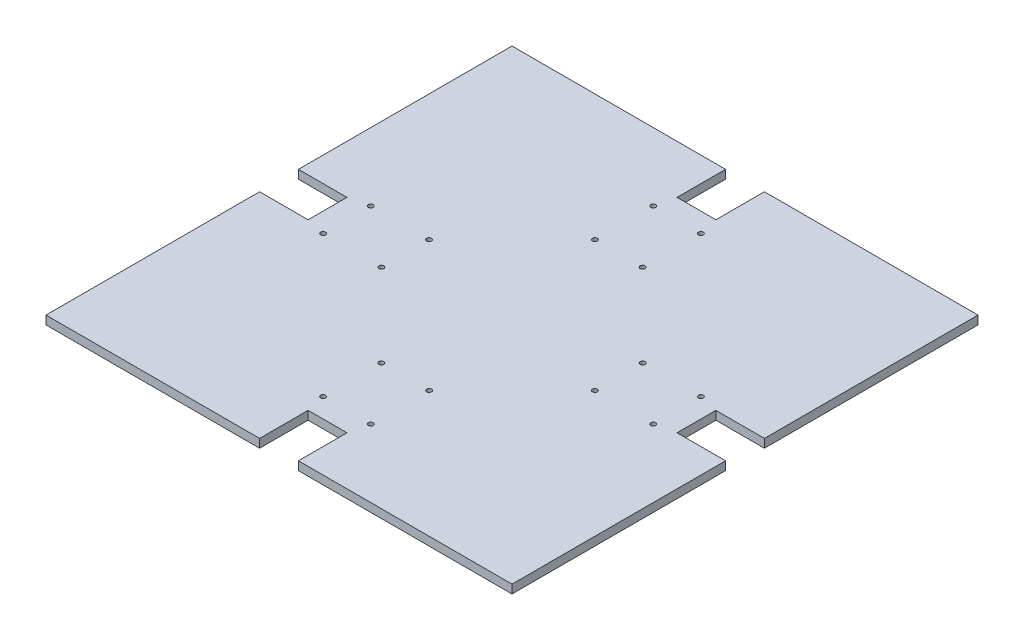
ISO-10303-21;
HEADER;
FILE_DESCRIPTION(('STEP AP214'),'2;1');
FILE_NAME('part.step','',(''),(''),'','','');
FILE_SCHEMA(('AUTOMOTIVE_DESIGN { 1 0 10303 214 1 1 1 1 }'));
ENDSEC;
DATA;
#1=APPLICATION_CONTEXT('core data for automotive mechanical design processes');
#2=APPLICATION_PROTOCOL_DEFINITION('international standard','automotive_design',2000,#1);
#3=PRODUCT_CONTEXT('',#1,'mechanical');
#4=PRODUCT('Part','Part','',(#3));
#5=PRODUCT_RELATED_PRODUCT_CATEGORY('part','',(#4));
#6=PRODUCT_DEFINITION_FORMATION('','',#4);
#7=PRODUCT_DEFINITION_CONTEXT('part definition',#1,'design');
#8=PRODUCT_DEFINITION('design','',#6,#7);
#9=PRODUCT_DEFINITION_SHAPE('','',#8);
#10=(LENGTH_UNIT() NAMED_UNIT(*) SI_UNIT(.MILLI.,.METRE.));
#11=(NAMED_UNIT(*) PLANE_ANGLE_UNIT() SI_UNIT($,.RADIAN.));
#12=(NAMED_UNIT(*) SI_UNIT($,.STERADIAN.) SOLID_ANGLE_UNIT());
#13=UNCERTAINTY_MEASURE_WITH_UNIT(LENGTH_MEASURE(1.E-05),#10,'distance_accuracy_value','');
#14=(GEOMETRIC_REPRESENTATION_CONTEXT(3) GLOBAL_UNCERTAINTY_ASSIGNED_CONTEXT((#13)) GLOBAL_UNIT_ASSIGNED_CONTEXT((#10,
#11,#12)) REPRESENTATION_CONTEXT('',''));
#15=CARTESIAN_POINT('',(0.,0.,0.));
#16=DIRECTION('',(0.,0.,1.));
#17=DIRECTION('',(1.,0.,0.));
#18=AXIS2_PLACEMENT_3D('',#15,#16,#17);
#19=CARTESIAN_POINT('',(152.4,5.588,-152.4));
#20=DIRECTION('',(-1.,0.,0.));
#21=DIRECTION('',(0.,0.,1.));
#22=AXIS2_PLACEMENT_3D('',#19,#20,#21);
#23=PLANE('',#22);
#24=DIRECTION('',(0.,0.,-1.));
#25=VECTOR('',#24,1.);
#26=CARTESIAN_POINT('',(152.4,0.,-152.4));
#27=LINE('',#26,#25);
#28=CARTESIAN_POINT('',(152.4,0.,152.4));
#29=VERTEX_POINT('',#28);
#30=CARTESIAN_POINT('',(152.4,0.,12.7));
#31=VERTEX_POINT('',#30);
#32=EDGE_CURVE('E202',#29,#31,#27,.T.);
#33=ORIENTED_EDGE('',*,*,#32,.T.);
#34=DIRECTION('',(0.,1.,0.));
#35=VECTOR('',#34,1.);
#36=CARTESIAN_POINT('',(152.4,0.,12.7));
#37=LINE('',#36,#35);
#38=CARTESIAN_POINT('',(152.4,5.588,12.7));
#39=VERTEX_POINT('',#38);
#40=EDGE_CURVE('E383',#31,#39,#37,.T.);
#41=ORIENTED_EDGE('',*,*,#40,.T.);
#42=DIRECTION('',(0.,0.,-1.));
#43=VECTOR('',#42,1.);
#44=CARTESIAN_POINT('',(152.4,5.588,-152.4));
#45=LINE('',#44,#43);
#46=CARTESIAN_POINT('',(152.4,5.588,152.4));
#47=VERTEX_POINT('',#46);
#48=EDGE_CURVE('E354',#47,#39,#45,.T.);
#49=ORIENTED_EDGE('',*,*,#48,.F.);
#50=DIRECTION('',(0.,-1.,0.));
#51=VECTOR('',#50,1.);
#52=CARTESIAN_POINT('',(152.4,5.588,152.4));
#53=LINE('',#52,#51);
#54=EDGE_CURVE('E212',#47,#29,#53,.T.);
#55=ORIENTED_EDGE('',*,*,#54,.T.);
#56=EDGE_LOOP('',(#33,#41,#49,#55));
#57=FACE_BOUND('',#56,.T.);
#58=ADVANCED_FACE('F33',(#57),#23,.F.);
#59=CARTESIAN_POINT('',(-152.4,5.588,-152.4));
#60=DIRECTION('',(0.,0.,1.));
#61=DIRECTION('',(1.,0.,0.));
#62=AXIS2_PLACEMENT_3D('',#59,#60,#61);
#63=PLANE('',#62);
#64=DIRECTION('',(-1.,0.,0.));
#65=VECTOR('',#64,1.);
#66=CARTESIAN_POINT('',(-152.4,0.,-152.4));
#67=LINE('',#66,#65);
#68=CARTESIAN_POINT('',(152.4,0.,-152.4));
#69=VERTEX_POINT('',#68);
#70=CARTESIAN_POINT('',(12.7,0.,-152.4));
#71=VERTEX_POINT('',#70);
#72=EDGE_CURVE('E190',#69,#71,#67,.T.);
#73=ORIENTED_EDGE('',*,*,#72,.T.);
#74=DIRECTION('',(0.,1.,0.));
#75=VECTOR('',#74,1.);
#76=CARTESIAN_POINT('',(12.7,0.,-152.4));
#77=LINE('',#76,#75);
#78=CARTESIAN_POINT('',(12.7,5.588,-152.4));
#79=VERTEX_POINT('',#78);
#80=EDGE_CURVE('E170',#71,#79,#77,.T.);
#81=ORIENTED_EDGE('',*,*,#80,.T.);
#82=DIRECTION('',(-1.,0.,0.));
#83=VECTOR('',#82,1.);
#84=CARTESIAN_POINT('',(-152.4,5.588,-152.4));
#85=LINE('',#84,#83);
#86=CARTESIAN_POINT('',(152.4,5.588,-152.4));
#87=VERTEX_POINT('',#86);
#88=EDGE_CURVE('E358',#87,#79,#85,.T.);
#89=ORIENTED_EDGE('',*,*,#88,.F.);
#90=DIRECTION('',(0.,-1.,0.));
#91=VECTOR('',#90,1.);
#92=CARTESIAN_POINT('',(152.4,5.588,-152.4));
#93=LINE('',#92,#91);
#94=EDGE_CURVE('E11',#87,#69,#93,.T.);
#95=ORIENTED_EDGE('',*,*,#94,.T.);
#96=EDGE_LOOP('',(#73,#81,#89,#95));
#97=FACE_BOUND('',#96,.T.);
#98=ADVANCED_FACE('F195',(#97),#63,.F.);
#99=CARTESIAN_POINT('',(-152.4,5.588,-152.4));
#100=DIRECTION('',(1.,0.,0.));
#101=DIRECTION('',(0.,0.,-1.));
#102=AXIS2_PLACEMENT_3D('',#99,#100,#101);
#103=PLANE('',#102);
#104=DIRECTION('',(0.,0.,1.));
#105=VECTOR('',#104,1.);
#106=CARTESIAN_POINT('',(-152.4,5.588,-152.4));
#107=LINE('',#106,#105);
#108=CARTESIAN_POINT('',(-152.4,5.588,12.7));
#109=VERTEX_POINT('',#108);
#110=CARTESIAN_POINT('',(-152.4,5.588,152.4));
#111=VERTEX_POINT('',#110);
#112=EDGE_CURVE('E360',#109,#111,#107,.T.);
#113=ORIENTED_EDGE('',*,*,#112,.F.);
#114=DIRECTION('',(0.,1.,0.));
#115=VECTOR('',#114,1.);
#116=CARTESIAN_POINT('',(-152.4,0.,12.7));
#117=LINE('',#116,#115);
#118=CARTESIAN_POINT('',(-152.4,0.,12.7));
#119=VERTEX_POINT('',#118);
#120=EDGE_CURVE('E257',#119,#109,#117,.T.);
#121=ORIENTED_EDGE('',*,*,#120,.F.);
#122=DIRECTION('',(0.,0.,1.));
#123=VECTOR('',#122,1.);
#124=CARTESIAN_POINT('',(-152.4,0.,-152.4));
#125=LINE('',#124,#123);
#126=CARTESIAN_POINT('',(-152.4,0.,152.4));
#127=VERTEX_POINT('',#126);
#128=EDGE_CURVE('E197',#119,#127,#125,.T.);
#129=ORIENTED_EDGE('',*,*,#128,.T.);
#130=DIRECTION('',(0.,-1.,0.));
#131=VECTOR('',#130,1.);
#132=CARTESIAN_POINT('',(-152.4,5.588,152.4));
#133=LINE('',#132,#131);
#134=EDGE_CURVE('E215',#111,#127,#133,.T.);
#135=ORIENTED_EDGE('',*,*,#134,.F.);
#136=EDGE_LOOP('',(#113,#121,#129,#135));
#137=FACE_BOUND('',#136,.T.);
#138=ADVANCED_FACE('F474',(#137),#103,.F.);
#139=CARTESIAN_POINT('',(-152.4,5.588,152.4));
#140=DIRECTION('',(0.,0.,-1.));
#141=DIRECTION('',(-1.,0.,0.));
#142=AXIS2_PLACEMENT_3D('',#139,#140,#141);
#143=PLANE('',#142);
#144=DIRECTION('',(1.,0.,0.));
#145=VECTOR('',#144,1.);
#146=CARTESIAN_POINT('',(-152.4,5.588,152.4));
#147=LINE('',#146,#145);
#148=CARTESIAN_POINT('',(12.7,5.588,152.4));
#149=VERTEX_POINT('',#148);
#150=EDGE_CURVE('E361',#149,#47,#147,.T.);
#151=ORIENTED_EDGE('',*,*,#150,.F.);
#152=DIRECTION('',(0.,1.,0.));
#153=VECTOR('',#152,1.);
#154=CARTESIAN_POINT('',(12.7,0.,152.4));
#155=LINE('',#154,#153);
#156=CARTESIAN_POINT('',(12.7,0.,152.4));
#157=VERTEX_POINT('',#156);
#158=EDGE_CURVE('E415',#157,#149,#155,.T.);
#159=ORIENTED_EDGE('',*,*,#158,.F.);
#160=DIRECTION('',(1.,0.,0.));
#161=VECTOR('',#160,1.);
#162=CARTESIAN_POINT('',(-152.4,0.,152.4));
#163=LINE('',#162,#161);
#164=EDGE_CURVE('E207',#157,#29,#163,.T.);
#165=ORIENTED_EDGE('',*,*,#164,.T.);
#166=ORIENTED_EDGE('',*,*,#54,.F.);
#167=EDGE_LOOP('',(#151,#159,#165,#166));
#168=FACE_BOUND('',#167,.T.);
#169=ADVANCED_FACE('F378',(#168),#143,.F.);
#170=CARTESIAN_POINT('',(152.4,5.588,-12.7));
#171=VERTEX_POINT('',#170);
#172=EDGE_CURVE('E211',#171,#87,#45,.T.);
#173=ORIENTED_EDGE('',*,*,#172,.F.);
#174=DIRECTION('',(0.,1.,0.));
#175=VECTOR('',#174,1.);
#176=CARTESIAN_POINT('',(152.4,0.,-12.7));
#177=LINE('',#176,#175);
#178=CARTESIAN_POINT('',(152.4,0.,-12.7));
#179=VERTEX_POINT('',#178);
#180=EDGE_CURVE('E398',#179,#171,#177,.T.);
#181=ORIENTED_EDGE('',*,*,#180,.F.);
#182=EDGE_CURVE('E351',#179,#69,#27,.T.);
#183=ORIENTED_EDGE('',*,*,#182,.T.);
#184=ORIENTED_EDGE('',*,*,#94,.F.);
#185=EDGE_LOOP('',(#173,#181,#183,#184));
#186=FACE_BOUND('',#185,.T.);
#187=ADVANCED_FACE('F35',(#186),#23,.F.);
#188=CARTESIAN_POINT('',(-12.7,5.588,-152.4));
#189=VERTEX_POINT('',#188);
#190=CARTESIAN_POINT('',(-152.4,5.588,-152.4));
#191=VERTEX_POINT('',#190);
#192=EDGE_CURVE('E357',#189,#191,#85,.T.);
#193=ORIENTED_EDGE('',*,*,#192,.F.);
#194=DIRECTION('',(0.,1.,0.));
#195=VECTOR('',#194,1.);
#196=CARTESIAN_POINT('',(-12.7,0.,-152.4));
#197=LINE('',#196,#195);
#198=CARTESIAN_POINT('',(-12.7,0.,-152.4));
#199=VERTEX_POINT('',#198);
#200=EDGE_CURVE('E181',#199,#189,#197,.T.);
#201=ORIENTED_EDGE('',*,*,#200,.F.);
#202=CARTESIAN_POINT('',(-152.4,0.,-152.4));
#203=VERTEX_POINT('',#202);
#204=EDGE_CURVE('E198',#199,#203,#67,.T.);
#205=ORIENTED_EDGE('',*,*,#204,.T.);
#206=DIRECTION('',(0.,-1.,0.));
#207=VECTOR('',#206,1.);
#208=CARTESIAN_POINT('',(-152.4,5.588,-152.4));
#209=LINE('',#208,#207);
#210=EDGE_CURVE('E41',#191,#203,#209,.T.);
#211=ORIENTED_EDGE('',*,*,#210,.F.);
#212=EDGE_LOOP('',(#193,#201,#205,#211));
#213=FACE_BOUND('',#212,.T.);
#214=ADVANCED_FACE('F475',(#213),#63,.F.);
#215=CARTESIAN_POINT('',(-152.4,0.,-12.7));
#216=VERTEX_POINT('',#215);
#217=EDGE_CURVE('E200',#203,#216,#125,.T.);
#218=ORIENTED_EDGE('',*,*,#217,.T.);
#219=DIRECTION('',(0.,1.,0.));
#220=VECTOR('',#219,1.);
#221=CARTESIAN_POINT('',(-152.4,0.,-12.7));
#222=LINE('',#221,#220);
#223=CARTESIAN_POINT('',(-152.4,5.588,-12.7));
#224=VERTEX_POINT('',#223);
#225=EDGE_CURVE('E259',#216,#224,#222,.T.);
#226=ORIENTED_EDGE('',*,*,#225,.T.);
#227=EDGE_CURVE('E226',#191,#224,#107,.T.);
#228=ORIENTED_EDGE('',*,*,#227,.F.);
#229=ORIENTED_EDGE('',*,*,#210,.T.);
#230=EDGE_LOOP('',(#218,#226,#228,#229));
#231=FACE_BOUND('',#230,.T.);
#232=ADVANCED_FACE('F223',(#231),#103,.F.);
#233=CARTESIAN_POINT('',(-12.7,0.,152.4));
#234=VERTEX_POINT('',#233);
#235=EDGE_CURVE('E208',#127,#234,#163,.T.);
#236=ORIENTED_EDGE('',*,*,#235,.T.);
#237=DIRECTION('',(0.,1.,0.));
#238=VECTOR('',#237,1.);
#239=CARTESIAN_POINT('',(-12.7,0.,152.4));
#240=LINE('',#239,#238);
#241=CARTESIAN_POINT('',(-12.7,5.588,152.4));
#242=VERTEX_POINT('',#241);
#243=EDGE_CURVE('E418',#234,#242,#240,.T.);
#244=ORIENTED_EDGE('',*,*,#243,.T.);
#245=EDGE_CURVE('E216',#111,#242,#147,.T.);
#246=ORIENTED_EDGE('',*,*,#245,.F.);
#247=ORIENTED_EDGE('',*,*,#134,.T.);
#248=EDGE_LOOP('',(#236,#244,#246,#247));
#249=FACE_BOUND('',#248,.T.);
#250=ADVANCED_FACE('F431',(#249),#143,.F.);
#251=CARTESIAN_POINT('',(0.,5.588,0.));
#252=DIRECTION('',(0.,1.,0.));
#253=DIRECTION('',(0.,0.,1.));
#254=AXIS2_PLACEMENT_3D('',#251,#252,#253);
#255=PLANE('',#254);
#256=CARTESIAN_POINT('',(107.95,5.588,-15.6));
#257=DIRECTION('',(0.,1.,0.));
#258=DIRECTION('',(0.,0.,1.));
#259=AXIS2_PLACEMENT_3D('',#256,#257,#258);
#260=CIRCLE('',#259,1.60000000000002);
#261=CARTESIAN_POINT('',(107.95,5.588,-14.));
#262=VERTEX_POINT('',#261);
#263=EDGE_CURVE('E266',#262,#262,#260,.T.);
#264=ORIENTED_EDGE('',*,*,#263,.F.);
#265=EDGE_LOOP('',(#264));
#266=FACE_BOUND('',#265,.T.);
#267=CARTESIAN_POINT('',(107.95,5.588,15.6));
#268=DIRECTION('',(0.,1.,0.));
#269=DIRECTION('',(0.,0.,1.));
#270=AXIS2_PLACEMENT_3D('',#267,#268,#269);
#271=CIRCLE('',#270,1.60000000000002);
#272=CARTESIAN_POINT('',(107.95,5.588,17.2));
#273=VERTEX_POINT('',#272);
#274=EDGE_CURVE('E272',#273,#273,#271,.T.);
#275=ORIENTED_EDGE('',*,*,#274,.F.);
#276=EDGE_LOOP('',(#275));
#277=FACE_BOUND('',#276,.T.);
#278=CARTESIAN_POINT('',(-15.6,5.588,-69.85));
#279=DIRECTION('',(0.,1.,0.));
#280=DIRECTION('',(0.,0.,1.));
#281=AXIS2_PLACEMENT_3D('',#278,#279,#280);
#282=CIRCLE('',#281,1.6);
#283=CARTESIAN_POINT('',(-15.6,5.588,-68.25));
#284=VERTEX_POINT('',#283);
#285=EDGE_CURVE('E278',#284,#284,#282,.T.);
#286=ORIENTED_EDGE('',*,*,#285,.F.);
#287=EDGE_LOOP('',(#286));
#288=FACE_BOUND('',#287,.T.);
#289=CARTESIAN_POINT('',(-15.6,5.588,-107.95));
#290=DIRECTION('',(0.,1.,0.));
#291=DIRECTION('',(0.,0.,1.));
#292=AXIS2_PLACEMENT_3D('',#289,#290,#291);
#293=CIRCLE('',#292,1.6);
#294=CARTESIAN_POINT('',(-15.6,5.588,-106.35));
#295=VERTEX_POINT('',#294);
#296=EDGE_CURVE('E284',#295,#295,#293,.T.);
#297=ORIENTED_EDGE('',*,*,#296,.F.);
#298=EDGE_LOOP('',(#297));
#299=FACE_BOUND('',#298,.T.);
#300=CARTESIAN_POINT('',(15.6,5.588,-107.95));
#301=DIRECTION('',(0.,1.,0.));
#302=DIRECTION('',(0.,0.,1.));
#303=AXIS2_PLACEMENT_3D('',#300,#301,#302);
#304=CIRCLE('',#303,1.60000000000001);
#305=CARTESIAN_POINT('',(15.6,5.588,-106.35));
#306=VERTEX_POINT('',#305);
#307=EDGE_CURVE('E290',#306,#306,#304,.T.);
#308=ORIENTED_EDGE('',*,*,#307,.F.);
#309=EDGE_LOOP('',(#308));
#310=FACE_BOUND('',#309,.T.);
#311=DIRECTION('',(0.,0.,-1.));
#312=VECTOR('',#311,1.);
#313=CARTESIAN_POINT('',(12.7,5.588,152.4));
#314=LINE('',#313,#312);
#315=CARTESIAN_POINT('',(12.7,5.588,120.65));
#316=VERTEX_POINT('',#315);
#317=EDGE_CURVE('E375',#149,#316,#314,.T.);
#318=ORIENTED_EDGE('',*,*,#317,.F.);
#319=ORIENTED_EDGE('',*,*,#150,.T.);
#320=ORIENTED_EDGE('',*,*,#48,.T.);
#321=DIRECTION('',(1.,0.,0.));
#322=VECTOR('',#321,1.);
#323=CARTESIAN_POINT('',(120.65,5.588,12.7));
#324=LINE('',#323,#322);
#325=CARTESIAN_POINT('',(120.65,5.588,12.7));
#326=VERTEX_POINT('',#325);
#327=EDGE_CURVE('E394',#326,#39,#324,.T.);
#328=ORIENTED_EDGE('',*,*,#327,.F.);
#329=DIRECTION('',(0.,0.,1.));
#330=VECTOR('',#329,1.);
#331=CARTESIAN_POINT('',(120.65,5.588,12.7));
#332=LINE('',#331,#330);
#333=CARTESIAN_POINT('',(120.65,5.588,-12.7));
#334=VERTEX_POINT('',#333);
#335=EDGE_CURVE('E489',#334,#326,#332,.T.);
#336=ORIENTED_EDGE('',*,*,#335,.F.);
#337=DIRECTION('',(-1.,0.,0.));
#338=VECTOR('',#337,1.);
#339=CARTESIAN_POINT('',(120.65,5.588,-12.7));
#340=LINE('',#339,#338);
#341=EDGE_CURVE('E417',#171,#334,#340,.T.);
#342=ORIENTED_EDGE('',*,*,#341,.F.);
#343=ORIENTED_EDGE('',*,*,#172,.T.);
#344=ORIENTED_EDGE('',*,*,#88,.T.);
#345=DIRECTION('',(0.,0.,-1.));
#346=VECTOR('',#345,1.);
#347=CARTESIAN_POINT('',(12.7,5.588,-120.65));
#348=LINE('',#347,#346);
#349=CARTESIAN_POINT('',(12.7,5.588,-120.65));
#350=VERTEX_POINT('',#349);
#351=EDGE_CURVE('E176',#350,#79,#348,.T.);
#352=ORIENTED_EDGE('',*,*,#351,.F.);
#353=DIRECTION('',(1.,0.,0.));
#354=VECTOR('',#353,1.);
#355=CARTESIAN_POINT('',(-12.7,5.588,-120.65));
#356=LINE('',#355,#354);
#357=CARTESIAN_POINT('',(-12.7,5.588,-120.65));
#358=VERTEX_POINT('',#357);
#359=EDGE_CURVE('E193',#358,#350,#356,.T.);
#360=ORIENTED_EDGE('',*,*,#359,.F.);
#361=DIRECTION('',(0.,0.,1.));
#362=VECTOR('',#361,1.);
#363=CARTESIAN_POINT('',(-12.7,5.588,-120.65));
#364=LINE('',#363,#362);
#365=EDGE_CURVE('E389',#189,#358,#364,.T.);
#366=ORIENTED_EDGE('',*,*,#365,.F.);
#367=ORIENTED_EDGE('',*,*,#192,.T.);
#368=ORIENTED_EDGE('',*,*,#227,.T.);
#369=DIRECTION('',(-1.,0.,0.));
#370=VECTOR('',#369,1.);
#371=CARTESIAN_POINT('',(-152.4,5.588,-12.7));
#372=LINE('',#371,#370);
#373=CARTESIAN_POINT('',(-120.65,5.588,-12.7));
#374=VERTEX_POINT('',#373);
#375=EDGE_CURVE('E249',#374,#224,#372,.T.);
#376=ORIENTED_EDGE('',*,*,#375,.F.);
#377=DIRECTION('',(0.,0.,-1.));
#378=VECTOR('',#377,1.);
#379=CARTESIAN_POINT('',(-120.65,5.588,12.7));
#380=LINE('',#379,#378);
#381=CARTESIAN_POINT('',(-120.65,5.588,12.7));
#382=VERTEX_POINT('',#381);
#383=EDGE_CURVE('E246',#382,#374,#380,.T.);
#384=ORIENTED_EDGE('',*,*,#383,.F.);
#385=DIRECTION('',(1.,0.,0.));
#386=VECTOR('',#385,1.);
#387=CARTESIAN_POINT('',(-152.4,5.588,12.7));
#388=LINE('',#387,#386);
#389=EDGE_CURVE('E242',#109,#382,#388,.T.);
#390=ORIENTED_EDGE('',*,*,#389,.F.);
#391=ORIENTED_EDGE('',*,*,#112,.T.);
#392=ORIENTED_EDGE('',*,*,#245,.T.);
#393=DIRECTION('',(0.,0.,1.));
#394=VECTOR('',#393,1.);
#395=CARTESIAN_POINT('',(-12.7,5.588,152.4));
#396=LINE('',#395,#394);
#397=CARTESIAN_POINT('',(-12.7,5.588,120.65));
#398=VERTEX_POINT('',#397);
#399=EDGE_CURVE('E405',#398,#242,#396,.T.);
#400=ORIENTED_EDGE('',*,*,#399,.F.);
#401=DIRECTION('',(-1.,0.,0.));
#402=VECTOR('',#401,1.);
#403=CARTESIAN_POINT('',(-12.7,5.588,120.65));
#404=LINE('',#403,#402);
#405=EDGE_CURVE('E411',#316,#398,#404,.T.);
#406=ORIENTED_EDGE('',*,*,#405,.F.);
#407=EDGE_LOOP('',(#318,#319,#320,#328,#336,#342,#343,#344,#352,#360,#366,#367,#368,#376,#384,
#390,#391,#392,#400,#406));
#408=FACE_BOUND('',#407,.T.);
#409=CARTESIAN_POINT('',(15.6,5.588,-69.85));
#410=DIRECTION('',(0.,1.,0.));
#411=DIRECTION('',(0.,0.,1.));
#412=AXIS2_PLACEMENT_3D('',#409,#410,#411);
#413=CIRCLE('',#412,1.60000000000001);
#414=CARTESIAN_POINT('',(15.6,5.588,-68.25));
#415=VERTEX_POINT('',#414);
#416=EDGE_CURVE('E256',#415,#415,#413,.T.);
#417=ORIENTED_EDGE('',*,*,#416,.F.);
#418=EDGE_LOOP('',(#417));
#419=FACE_BOUND('',#418,.T.);
#420=CARTESIAN_POINT('',(-69.8500000000001,5.588,15.6));
#421=DIRECTION('',(0.,1.,0.));
#422=DIRECTION('',(0.,0.,1.));
#423=AXIS2_PLACEMENT_3D('',#420,#421,#422);
#424=CIRCLE('',#423,1.6);
#425=CARTESIAN_POINT('',(-69.8500000000001,5.588,17.2));
#426=VERTEX_POINT('',#425);
#427=EDGE_CURVE('E328',#426,#426,#424,.T.);
#428=ORIENTED_EDGE('',*,*,#427,.F.);
#429=EDGE_LOOP('',(#428));
#430=FACE_BOUND('',#429,.T.);
#431=CARTESIAN_POINT('',(-107.95,5.588,15.6));
#432=DIRECTION('',(0.,1.,0.));
#433=DIRECTION('',(0.,0.,1.));
#434=AXIS2_PLACEMENT_3D('',#431,#432,#433);
#435=CIRCLE('',#434,1.59999999999999);
#436=CARTESIAN_POINT('',(-107.95,5.588,17.2));
#437=VERTEX_POINT('',#436);
#438=EDGE_CURVE('E334',#437,#437,#435,.T.);
#439=ORIENTED_EDGE('',*,*,#438,.F.);
#440=EDGE_LOOP('',(#439));
#441=FACE_BOUND('',#440,.T.);
#442=CARTESIAN_POINT('',(-15.6,5.588,69.8500000000001));
#443=DIRECTION('',(0.,1.,0.));
#444=DIRECTION('',(0.,0.,1.));
#445=AXIS2_PLACEMENT_3D('',#442,#443,#444);
#446=CIRCLE('',#445,1.60000000000001);
#447=CARTESIAN_POINT('',(-15.6,5.588,71.4500000000001));
#448=VERTEX_POINT('',#447);
#449=EDGE_CURVE('E340',#448,#448,#446,.T.);
#450=ORIENTED_EDGE('',*,*,#449,.F.);
#451=EDGE_LOOP('',(#450));
#452=FACE_BOUND('',#451,.T.);
#453=CARTESIAN_POINT('',(15.6,5.588,69.8500000000001));
#454=DIRECTION('',(0.,1.,0.));
#455=DIRECTION('',(0.,0.,1.));
#456=AXIS2_PLACEMENT_3D('',#453,#454,#455);
#457=CIRCLE('',#456,1.60000000000002);
#458=CARTESIAN_POINT('',(15.6,5.588,71.4500000000001));
#459=VERTEX_POINT('',#458);
#460=EDGE_CURVE('E297',#459,#459,#457,.T.);
#461=ORIENTED_EDGE('',*,*,#460,.F.);
#462=EDGE_LOOP('',(#461));
#463=FACE_BOUND('',#462,.T.);
#464=CARTESIAN_POINT('',(-107.95,5.588,-15.6));
#465=DIRECTION('',(0.,1.,0.));
#466=DIRECTION('',(0.,0.,1.));
#467=AXIS2_PLACEMENT_3D('',#464,#465,#466);
#468=CIRCLE('',#467,1.59999999999999);
#469=CARTESIAN_POINT('',(-107.95,5.588,-14.));
#470=VERTEX_POINT('',#469);
#471=EDGE_CURVE('E298',#470,#470,#468,.T.);
#472=ORIENTED_EDGE('',*,*,#471,.F.);
#473=EDGE_LOOP('',(#472));
#474=FACE_BOUND('',#473,.T.);
#475=CARTESIAN_POINT('',(-15.6,5.588,107.95));
#476=DIRECTION('',(0.,1.,0.));
#477=DIRECTION('',(0.,0.,1.));
#478=AXIS2_PLACEMENT_3D('',#475,#476,#477);
#479=CIRCLE('',#478,1.6);
#480=CARTESIAN_POINT('',(-15.6,5.588,109.55));
#481=VERTEX_POINT('',#480);
#482=EDGE_CURVE('E304',#481,#481,#479,.T.);
#483=ORIENTED_EDGE('',*,*,#482,.F.);
#484=EDGE_LOOP('',(#483));
#485=FACE_BOUND('',#484,.T.);
#486=CARTESIAN_POINT('',(15.6,5.588,107.95));
#487=DIRECTION('',(0.,1.,0.));
#488=DIRECTION('',(0.,0.,1.));
#489=AXIS2_PLACEMENT_3D('',#486,#487,#488);
#490=CIRCLE('',#489,1.60000000000001);
#491=CARTESIAN_POINT('',(15.6,5.588,109.55));
#492=VERTEX_POINT('',#491);
#493=EDGE_CURVE('E310',#492,#492,#490,.T.);
#494=ORIENTED_EDGE('',*,*,#493,.F.);
#495=EDGE_LOOP('',(#494));
#496=FACE_BOUND('',#495,.T.);
#497=CARTESIAN_POINT('',(69.8500000000001,5.588,15.6));
#498=DIRECTION('',(0.,1.,0.));
#499=DIRECTION('',(0.,0.,1.));
#500=AXIS2_PLACEMENT_3D('',#497,#498,#499);
#501=CIRCLE('',#500,1.6);
#502=CARTESIAN_POINT('',(69.8500000000001,5.588,17.2));
#503=VERTEX_POINT('',#502);
#504=EDGE_CURVE('E316',#503,#503,#501,.T.);
#505=ORIENTED_EDGE('',*,*,#504,.F.);
#506=EDGE_LOOP('',(#505));
#507=FACE_BOUND('',#506,.T.);
#508=CARTESIAN_POINT('',(69.8500000000002,5.588,-15.6));
#509=DIRECTION('',(0.,1.,0.));
#510=DIRECTION('',(0.,0.,1.));
#511=AXIS2_PLACEMENT_3D('',#508,#509,#510);
#512=CIRCLE('',#511,1.6);
#513=CARTESIAN_POINT('',(69.8500000000002,5.588,-14.));
#514=VERTEX_POINT('',#513);
#515=EDGE_CURVE('E265',#514,#514,#512,.T.);
#516=ORIENTED_EDGE('',*,*,#515,.F.);
#517=EDGE_LOOP('',(#516));
#518=FACE_BOUND('',#517,.T.);
#519=CARTESIAN_POINT('',(-69.8500000000001,5.588,-15.6));
#520=DIRECTION('',(0.,1.,0.));
#521=DIRECTION('',(0.,0.,1.));
#522=AXIS2_PLACEMENT_3D('',#519,#520,#521);
#523=CIRCLE('',#522,1.60000000000001);
#524=CARTESIAN_POINT('',(-69.8500000000001,5.588,-14.));
#525=VERTEX_POINT('',#524);
#526=EDGE_CURVE('E327',#525,#525,#523,.T.);
#527=ORIENTED_EDGE('',*,*,#526,.F.);
#528=EDGE_LOOP('',(#527));
#529=FACE_BOUND('',#528,.T.);
#530=ADVANCED_FACE('F369',(#266,#277,#288,#299,#310,#408,#419,#430,#441,#452,#463,#474,#485,
#496,#507,#518,#529),#255,.T.);
#531=CARTESIAN_POINT('',(0.,0.,0.));
#532=DIRECTION('',(0.,1.,0.));
#533=DIRECTION('',(0.,0.,1.));
#534=AXIS2_PLACEMENT_3D('',#531,#532,#533);
#535=PLANE('',#534);
#536=CARTESIAN_POINT('',(107.95,0.,-15.6));
#537=DIRECTION('',(0.,1.,0.));
#538=DIRECTION('',(0.,0.,1.));
#539=AXIS2_PLACEMENT_3D('',#536,#537,#538);
#540=CIRCLE('',#539,1.60000000000002);
#541=CARTESIAN_POINT('',(107.95,0.,-14.));
#542=VERTEX_POINT('',#541);
#543=EDGE_CURVE('E262',#542,#542,#540,.T.);
#544=ORIENTED_EDGE('',*,*,#543,.T.);
#545=EDGE_LOOP('',(#544));
#546=FACE_BOUND('',#545,.T.);
#547=CARTESIAN_POINT('',(107.95,0.,15.6));
#548=DIRECTION('',(0.,1.,0.));
#549=DIRECTION('',(0.,0.,1.));
#550=AXIS2_PLACEMENT_3D('',#547,#548,#549);
#551=CIRCLE('',#550,1.60000000000002);
#552=CARTESIAN_POINT('',(107.95,0.,17.2));
#553=VERTEX_POINT('',#552);
#554=EDGE_CURVE('E269',#553,#553,#551,.T.);
#555=ORIENTED_EDGE('',*,*,#554,.T.);
#556=EDGE_LOOP('',(#555));
#557=FACE_BOUND('',#556,.T.);
#558=CARTESIAN_POINT('',(-15.6,0.,-69.85));
#559=DIRECTION('',(0.,1.,0.));
#560=DIRECTION('',(0.,0.,1.));
#561=AXIS2_PLACEMENT_3D('',#558,#559,#560);
#562=CIRCLE('',#561,1.6);
#563=CARTESIAN_POINT('',(-15.6,0.,-68.25));
#564=VERTEX_POINT('',#563);
#565=EDGE_CURVE('E275',#564,#564,#562,.T.);
#566=ORIENTED_EDGE('',*,*,#565,.T.);
#567=EDGE_LOOP('',(#566));
#568=FACE_BOUND('',#567,.T.);
#569=CARTESIAN_POINT('',(-15.6,0.,-107.95));
#570=DIRECTION('',(0.,1.,0.));
#571=DIRECTION('',(0.,0.,1.));
#572=AXIS2_PLACEMENT_3D('',#569,#570,#571);
#573=CIRCLE('',#572,1.6);
#574=CARTESIAN_POINT('',(-15.6,0.,-106.35));
#575=VERTEX_POINT('',#574);
#576=EDGE_CURVE('E281',#575,#575,#573,.T.);
#577=ORIENTED_EDGE('',*,*,#576,.T.);
#578=EDGE_LOOP('',(#577));
#579=FACE_BOUND('',#578,.T.);
#580=CARTESIAN_POINT('',(15.6,0.,-107.95));
#581=DIRECTION('',(0.,1.,0.));
#582=DIRECTION('',(0.,0.,1.));
#583=AXIS2_PLACEMENT_3D('',#580,#581,#582);
#584=CIRCLE('',#583,1.60000000000001);
#585=CARTESIAN_POINT('',(15.6,0.,-106.35));
#586=VERTEX_POINT('',#585);
#587=EDGE_CURVE('E287',#586,#586,#584,.T.);
#588=ORIENTED_EDGE('',*,*,#587,.T.);
#589=EDGE_LOOP('',(#588));
#590=FACE_BOUND('',#589,.T.);
#591=ORIENTED_EDGE('',*,*,#164,.F.);
#592=DIRECTION('',(0.,0.,-1.));
#593=VECTOR('',#592,1.);
#594=CARTESIAN_POINT('',(12.7,0.,152.4));
#595=LINE('',#594,#593);
#596=CARTESIAN_POINT('',(12.7,0.,120.65));
#597=VERTEX_POINT('',#596);
#598=EDGE_CURVE('E401',#157,#597,#595,.T.);
#599=ORIENTED_EDGE('',*,*,#598,.T.);
#600=DIRECTION('',(-1.,0.,0.));
#601=VECTOR('',#600,1.);
#602=CARTESIAN_POINT('',(-12.7,0.,120.65));
#603=LINE('',#602,#601);
#604=CARTESIAN_POINT('',(-12.7,0.,120.65));
#605=VERTEX_POINT('',#604);
#606=EDGE_CURVE('E404',#597,#605,#603,.T.);
#607=ORIENTED_EDGE('',*,*,#606,.T.);
#608=DIRECTION('',(0.,0.,1.));
#609=VECTOR('',#608,1.);
#610=CARTESIAN_POINT('',(-12.7,0.,152.4));
#611=LINE('',#610,#609);
#612=EDGE_CURVE('E48',#605,#234,#611,.T.);
#613=ORIENTED_EDGE('',*,*,#612,.T.);
#614=ORIENTED_EDGE('',*,*,#235,.F.);
#615=ORIENTED_EDGE('',*,*,#128,.F.);
#616=DIRECTION('',(1.,0.,0.));
#617=VECTOR('',#616,1.);
#618=CARTESIAN_POINT('',(-152.4,0.,12.7));
#619=LINE('',#618,#617);
#620=CARTESIAN_POINT('',(-120.65,0.,12.7));
#621=VERTEX_POINT('',#620);
#622=EDGE_CURVE('E238',#119,#621,#619,.T.);
#623=ORIENTED_EDGE('',*,*,#622,.T.);
#624=DIRECTION('',(0.,0.,-1.));
#625=VECTOR('',#624,1.);
#626=CARTESIAN_POINT('',(-120.65,0.,12.7));
#627=LINE('',#626,#625);
#628=CARTESIAN_POINT('',(-120.65,0.,-12.7));
#629=VERTEX_POINT('',#628);
#630=EDGE_CURVE('E236',#621,#629,#627,.T.);
#631=ORIENTED_EDGE('',*,*,#630,.T.);
#632=DIRECTION('',(-1.,0.,0.));
#633=VECTOR('',#632,1.);
#634=CARTESIAN_POINT('',(-152.4,0.,-12.7));
#635=LINE('',#634,#633);
#636=EDGE_CURVE('E233',#629,#216,#635,.T.);
#637=ORIENTED_EDGE('',*,*,#636,.T.);
#638=ORIENTED_EDGE('',*,*,#217,.F.);
#639=ORIENTED_EDGE('',*,*,#204,.F.);
#640=DIRECTION('',(0.,0.,1.));
#641=VECTOR('',#640,1.);
#642=CARTESIAN_POINT('',(-12.7,0.,-120.65));
#643=LINE('',#642,#641);
#644=CARTESIAN_POINT('',(-12.7,0.,-120.65));
#645=VERTEX_POINT('',#644);
#646=EDGE_CURVE('E192',#199,#645,#643,.T.);
#647=ORIENTED_EDGE('',*,*,#646,.T.);
#648=DIRECTION('',(1.,0.,0.));
#649=VECTOR('',#648,1.);
#650=CARTESIAN_POINT('',(-12.7,0.,-120.65));
#651=LINE('',#650,#649);
#652=CARTESIAN_POINT('',(12.7,0.,-120.65));
#653=VERTEX_POINT('',#652);
#654=EDGE_CURVE('E182',#645,#653,#651,.T.);
#655=ORIENTED_EDGE('',*,*,#654,.T.);
#656=DIRECTION('',(0.,0.,-1.));
#657=VECTOR('',#656,1.);
#658=CARTESIAN_POINT('',(12.7,0.,-120.65));
#659=LINE('',#658,#657);
#660=EDGE_CURVE('E173',#653,#71,#659,.T.);
#661=ORIENTED_EDGE('',*,*,#660,.T.);
#662=ORIENTED_EDGE('',*,*,#72,.F.);
#663=ORIENTED_EDGE('',*,*,#182,.F.);
#664=DIRECTION('',(-1.,0.,0.));
#665=VECTOR('',#664,1.);
#666=CARTESIAN_POINT('',(120.65,0.,-12.7));
#667=LINE('',#666,#665);
#668=CARTESIAN_POINT('',(120.65,0.,-12.7));
#669=VERTEX_POINT('',#668);
#670=EDGE_CURVE('E495',#179,#669,#667,.T.);
#671=ORIENTED_EDGE('',*,*,#670,.T.);
#672=DIRECTION('',(0.,0.,1.));
#673=VECTOR('',#672,1.);
#674=CARTESIAN_POINT('',(120.65,0.,12.7));
#675=LINE('',#674,#673);
#676=CARTESIAN_POINT('',(120.65,0.,12.7));
#677=VERTEX_POINT('',#676);
#678=EDGE_CURVE('E56',#669,#677,#675,.T.);
#679=ORIENTED_EDGE('',*,*,#678,.T.);
#680=DIRECTION('',(1.,0.,0.));
#681=VECTOR('',#680,1.);
#682=CARTESIAN_POINT('',(120.65,0.,12.7));
#683=LINE('',#682,#681);
#684=EDGE_CURVE('E400',#677,#31,#683,.T.);
#685=ORIENTED_EDGE('',*,*,#684,.T.);
#686=ORIENTED_EDGE('',*,*,#32,.F.);
#687=EDGE_LOOP('',(#591,#599,#607,#613,#614,#615,#623,#631,#637,#638,#639,#647,#655,#661,#662,
#663,#671,#679,#685,#686));
#688=FACE_BOUND('',#687,.T.);
#689=CARTESIAN_POINT('',(15.6,0.,-69.85));
#690=DIRECTION('',(0.,1.,0.));
#691=DIRECTION('',(0.,0.,1.));
#692=AXIS2_PLACEMENT_3D('',#689,#690,#691);
#693=CIRCLE('',#692,1.60000000000001);
#694=CARTESIAN_POINT('',(15.6,0.,-68.25));
#695=VERTEX_POINT('',#694);
#696=EDGE_CURVE('E293',#695,#695,#693,.T.);
#697=ORIENTED_EDGE('',*,*,#696,.T.);
#698=EDGE_LOOP('',(#697));
#699=FACE_BOUND('',#698,.T.);
#700=CARTESIAN_POINT('',(-69.8500000000001,0.,15.6));
#701=DIRECTION('',(0.,1.,0.));
#702=DIRECTION('',(0.,0.,1.));
#703=AXIS2_PLACEMENT_3D('',#700,#701,#702);
#704=CIRCLE('',#703,1.6);
#705=CARTESIAN_POINT('',(-69.8500000000001,0.,17.2));
#706=VERTEX_POINT('',#705);
#707=EDGE_CURVE('E324',#706,#706,#704,.T.);
#708=ORIENTED_EDGE('',*,*,#707,.T.);
#709=EDGE_LOOP('',(#708));
#710=FACE_BOUND('',#709,.T.);
#711=CARTESIAN_POINT('',(-107.95,0.,15.6));
#712=DIRECTION('',(0.,1.,0.));
#713=DIRECTION('',(0.,0.,1.));
#714=AXIS2_PLACEMENT_3D('',#711,#712,#713);
#715=CIRCLE('',#714,1.59999999999999);
#716=CARTESIAN_POINT('',(-107.95,0.,17.2));
#717=VERTEX_POINT('',#716);
#718=EDGE_CURVE('E331',#717,#717,#715,.T.);
#719=ORIENTED_EDGE('',*,*,#718,.T.);
#720=EDGE_LOOP('',(#719));
#721=FACE_BOUND('',#720,.T.);
#722=CARTESIAN_POINT('',(-15.6,0.,69.8500000000001));
#723=DIRECTION('',(0.,1.,0.));
#724=DIRECTION('',(0.,0.,1.));
#725=AXIS2_PLACEMENT_3D('',#722,#723,#724);
#726=CIRCLE('',#725,1.60000000000001);
#727=CARTESIAN_POINT('',(-15.6,0.,71.4500000000001));
#728=VERTEX_POINT('',#727);
#729=EDGE_CURVE('E337',#728,#728,#726,.T.);
#730=ORIENTED_EDGE('',*,*,#729,.T.);
#731=EDGE_LOOP('',(#730));
#732=FACE_BOUND('',#731,.T.);
#733=CARTESIAN_POINT('',(15.6,0.,69.8500000000001));
#734=DIRECTION('',(0.,1.,0.));
#735=DIRECTION('',(0.,0.,1.));
#736=AXIS2_PLACEMENT_3D('',#733,#734,#735);
#737=CIRCLE('',#736,1.60000000000002);
#738=CARTESIAN_POINT('',(15.6,0.,71.4500000000001));
#739=VERTEX_POINT('',#738);
#740=EDGE_CURVE('E343',#739,#739,#737,.T.);
#741=ORIENTED_EDGE('',*,*,#740,.T.);
#742=EDGE_LOOP('',(#741));
#743=FACE_BOUND('',#742,.T.);
#744=CARTESIAN_POINT('',(-107.95,0.,-15.6));
#745=DIRECTION('',(0.,1.,0.));
#746=DIRECTION('',(0.,0.,1.));
#747=AXIS2_PLACEMENT_3D('',#744,#745,#746);
#748=CIRCLE('',#747,1.59999999999999);
#749=CARTESIAN_POINT('',(-107.95,0.,-14.));
#750=VERTEX_POINT('',#749);
#751=EDGE_CURVE('E294',#750,#750,#748,.T.);
#752=ORIENTED_EDGE('',*,*,#751,.T.);
#753=EDGE_LOOP('',(#752));
#754=FACE_BOUND('',#753,.T.);
#755=CARTESIAN_POINT('',(-15.6,0.,107.95));
#756=DIRECTION('',(0.,1.,0.));
#757=DIRECTION('',(0.,0.,1.));
#758=AXIS2_PLACEMENT_3D('',#755,#756,#757);
#759=CIRCLE('',#758,1.6);
#760=CARTESIAN_POINT('',(-15.6,0.,109.55));
#761=VERTEX_POINT('',#760);
#762=EDGE_CURVE('E301',#761,#761,#759,.T.);
#763=ORIENTED_EDGE('',*,*,#762,.T.);
#764=EDGE_LOOP('',(#763));
#765=FACE_BOUND('',#764,.T.);
#766=CARTESIAN_POINT('',(15.6,0.,107.95));
#767=DIRECTION('',(0.,1.,0.));
#768=DIRECTION('',(0.,0.,1.));
#769=AXIS2_PLACEMENT_3D('',#766,#767,#768);
#770=CIRCLE('',#769,1.60000000000001);
#771=CARTESIAN_POINT('',(15.6,0.,109.55));
#772=VERTEX_POINT('',#771);
#773=EDGE_CURVE('E307',#772,#772,#770,.T.);
#774=ORIENTED_EDGE('',*,*,#773,.T.);
#775=EDGE_LOOP('',(#774));
#776=FACE_BOUND('',#775,.T.);
#777=CARTESIAN_POINT('',(69.8500000000001,0.,15.6));
#778=DIRECTION('',(0.,1.,0.));
#779=DIRECTION('',(0.,0.,1.));
#780=AXIS2_PLACEMENT_3D('',#777,#778,#779);
#781=CIRCLE('',#780,1.6);
#782=CARTESIAN_POINT('',(69.8500000000001,0.,17.2));
#783=VERTEX_POINT('',#782);
#784=EDGE_CURVE('E313',#783,#783,#781,.T.);
#785=ORIENTED_EDGE('',*,*,#784,.T.);
#786=EDGE_LOOP('',(#785));
#787=FACE_BOUND('',#786,.T.);
#788=CARTESIAN_POINT('',(69.8500000000002,0.,-15.6));
#789=DIRECTION('',(0.,1.,0.));
#790=DIRECTION('',(0.,0.,1.));
#791=AXIS2_PLACEMENT_3D('',#788,#789,#790);
#792=CIRCLE('',#791,1.6);
#793=CARTESIAN_POINT('',(69.8500000000002,0.,-14.));
#794=VERTEX_POINT('',#793);
#795=EDGE_CURVE('E319',#794,#794,#792,.T.);
#796=ORIENTED_EDGE('',*,*,#795,.T.);
#797=EDGE_LOOP('',(#796));
#798=FACE_BOUND('',#797,.T.);
#799=CARTESIAN_POINT('',(-69.8500000000001,0.,-15.6));
#800=DIRECTION('',(0.,1.,0.));
#801=DIRECTION('',(0.,0.,1.));
#802=AXIS2_PLACEMENT_3D('',#799,#800,#801);
#803=CIRCLE('',#802,1.60000000000001);
#804=CARTESIAN_POINT('',(-69.8500000000001,0.,-14.));
#805=VERTEX_POINT('',#804);
#806=EDGE_CURVE('E348',#805,#805,#803,.T.);
#807=ORIENTED_EDGE('',*,*,#806,.T.);
#808=EDGE_LOOP('',(#807));
#809=FACE_BOUND('',#808,.T.);
#810=ADVANCED_FACE('F187',(#546,#557,#568,#579,#590,#688,#699,#710,#721,#732,#743,#754,#765,
#776,#787,#798,#809),#535,.F.);
#811=CARTESIAN_POINT('',(-69.8500000000001,0.,-15.6));
#812=DIRECTION('',(0.,1.,0.));
#813=DIRECTION('',(0.,0.,1.));
#814=AXIS2_PLACEMENT_3D('',#811,#812,#813);
#815=CYLINDRICAL_SURFACE('',#814,1.60000000000001);
#816=ORIENTED_EDGE('',*,*,#806,.F.);
#817=EDGE_LOOP('',(#816));
#818=FACE_BOUND('',#817,.T.);
#819=ORIENTED_EDGE('',*,*,#526,.T.);
#820=EDGE_LOOP('',(#819));
#821=FACE_BOUND('',#820,.T.);
#822=ADVANCED_FACE('F454',(#818,#821),#815,.F.);
#823=CARTESIAN_POINT('',(69.8500000000002,0.,-15.6));
#824=DIRECTION('',(0.,1.,0.));
#825=DIRECTION('',(0.,0.,1.));
#826=AXIS2_PLACEMENT_3D('',#823,#824,#825);
#827=CYLINDRICAL_SURFACE('',#826,1.6);
#828=ORIENTED_EDGE('',*,*,#795,.F.);
#829=EDGE_LOOP('',(#828));
#830=FACE_BOUND('',#829,.T.);
#831=ORIENTED_EDGE('',*,*,#515,.T.);
#832=EDGE_LOOP('',(#831));
#833=FACE_BOUND('',#832,.T.);
#834=ADVANCED_FACE('F456',(#830,#833),#827,.F.);
#835=CARTESIAN_POINT('',(69.8500000000001,0.,15.6));
#836=DIRECTION('',(0.,1.,0.));
#837=DIRECTION('',(0.,0.,1.));
#838=AXIS2_PLACEMENT_3D('',#835,#836,#837);
#839=CYLINDRICAL_SURFACE('',#838,1.6);
#840=ORIENTED_EDGE('',*,*,#784,.F.);
#841=EDGE_LOOP('',(#840));
#842=FACE_BOUND('',#841,.T.);
#843=ORIENTED_EDGE('',*,*,#504,.T.);
#844=EDGE_LOOP('',(#843));
#845=FACE_BOUND('',#844,.T.);
#846=ADVANCED_FACE('F463',(#842,#845),#839,.F.);
#847=CARTESIAN_POINT('',(15.6,0.,107.95));
#848=DIRECTION('',(0.,1.,0.));
#849=DIRECTION('',(0.,0.,1.));
#850=AXIS2_PLACEMENT_3D('',#847,#848,#849);
#851=CYLINDRICAL_SURFACE('',#850,1.60000000000001);
#852=ORIENTED_EDGE('',*,*,#773,.F.);
#853=EDGE_LOOP('',(#852));
#854=FACE_BOUND('',#853,.T.);
#855=ORIENTED_EDGE('',*,*,#493,.T.);
#856=EDGE_LOOP('',(#855));
#857=FACE_BOUND('',#856,.T.);
#858=ADVANCED_FACE('F588',(#854,#857),#851,.F.);
#859=CARTESIAN_POINT('',(-15.6,0.,107.95));
#860=DIRECTION('',(0.,1.,0.));
#861=DIRECTION('',(0.,0.,1.));
#862=AXIS2_PLACEMENT_3D('',#859,#860,#861);
#863=CYLINDRICAL_SURFACE('',#862,1.6);
#864=ORIENTED_EDGE('',*,*,#762,.F.);
#865=EDGE_LOOP('',(#864));
#866=FACE_BOUND('',#865,.T.);
#867=ORIENTED_EDGE('',*,*,#482,.T.);
#868=EDGE_LOOP('',(#867));
#869=FACE_BOUND('',#868,.T.);
#870=ADVANCED_FACE('F584',(#866,#869),#863,.F.);
#871=CARTESIAN_POINT('',(-107.95,0.,-15.6));
#872=DIRECTION('',(0.,1.,0.));
#873=DIRECTION('',(0.,0.,1.));
#874=AXIS2_PLACEMENT_3D('',#871,#872,#873);
#875=CYLINDRICAL_SURFACE('',#874,1.59999999999999);
#876=ORIENTED_EDGE('',*,*,#751,.F.);
#877=EDGE_LOOP('',(#876));
#878=FACE_BOUND('',#877,.T.);
#879=ORIENTED_EDGE('',*,*,#471,.T.);
#880=EDGE_LOOP('',(#879));
#881=FACE_BOUND('',#880,.T.);
#882=ADVANCED_FACE('F580',(#878,#881),#875,.F.);
#883=CARTESIAN_POINT('',(15.6,0.,69.8500000000001));
#884=DIRECTION('',(0.,1.,0.));
#885=DIRECTION('',(0.,0.,1.));
#886=AXIS2_PLACEMENT_3D('',#883,#884,#885);
#887=CYLINDRICAL_SURFACE('',#886,1.60000000000002);
#888=ORIENTED_EDGE('',*,*,#740,.F.);
#889=EDGE_LOOP('',(#888));
#890=FACE_BOUND('',#889,.T.);
#891=ORIENTED_EDGE('',*,*,#460,.T.);
#892=EDGE_LOOP('',(#891));
#893=FACE_BOUND('',#892,.T.);
#894=ADVANCED_FACE('F583',(#890,#893),#887,.F.);
#895=CARTESIAN_POINT('',(-15.6,0.,69.8500000000001));
#896=DIRECTION('',(0.,1.,0.));
#897=DIRECTION('',(0.,0.,1.));
#898=AXIS2_PLACEMENT_3D('',#895,#896,#897);
#899=CYLINDRICAL_SURFACE('',#898,1.60000000000001);
#900=ORIENTED_EDGE('',*,*,#729,.F.);
#901=EDGE_LOOP('',(#900));
#902=FACE_BOUND('',#901,.T.);
#903=ORIENTED_EDGE('',*,*,#449,.T.);
#904=EDGE_LOOP('',(#903));
#905=FACE_BOUND('',#904,.T.);
#906=ADVANCED_FACE('F602',(#902,#905),#899,.F.);
#907=CARTESIAN_POINT('',(-107.95,0.,15.6));
#908=DIRECTION('',(0.,1.,0.));
#909=DIRECTION('',(0.,0.,1.));
#910=AXIS2_PLACEMENT_3D('',#907,#908,#909);
#911=CYLINDRICAL_SURFACE('',#910,1.59999999999999);
#912=ORIENTED_EDGE('',*,*,#718,.F.);
#913=EDGE_LOOP('',(#912));
#914=FACE_BOUND('',#913,.T.);
#915=ORIENTED_EDGE('',*,*,#438,.T.);
#916=EDGE_LOOP('',(#915));
#917=FACE_BOUND('',#916,.T.);
#918=ADVANCED_FACE('F598',(#914,#917),#911,.F.);
#919=CARTESIAN_POINT('',(-69.8500000000001,0.,15.6));
#920=DIRECTION('',(0.,1.,0.));
#921=DIRECTION('',(0.,0.,1.));
#922=AXIS2_PLACEMENT_3D('',#919,#920,#921);
#923=CYLINDRICAL_SURFACE('',#922,1.6);
#924=ORIENTED_EDGE('',*,*,#707,.F.);
#925=EDGE_LOOP('',(#924));
#926=FACE_BOUND('',#925,.T.);
#927=ORIENTED_EDGE('',*,*,#427,.T.);
#928=EDGE_LOOP('',(#927));
#929=FACE_BOUND('',#928,.T.);
#930=ADVANCED_FACE('F550',(#926,#929),#923,.F.);
#931=CARTESIAN_POINT('',(15.6,0.,-69.85));
#932=DIRECTION('',(0.,1.,0.));
#933=DIRECTION('',(0.,0.,1.));
#934=AXIS2_PLACEMENT_3D('',#931,#932,#933);
#935=CYLINDRICAL_SURFACE('',#934,1.60000000000001);
#936=ORIENTED_EDGE('',*,*,#696,.F.);
#937=EDGE_LOOP('',(#936));
#938=FACE_BOUND('',#937,.T.);
#939=ORIENTED_EDGE('',*,*,#416,.T.);
#940=EDGE_LOOP('',(#939));
#941=FACE_BOUND('',#940,.T.);
#942=ADVANCED_FACE('F428',(#938,#941),#935,.F.);
#943=CARTESIAN_POINT('',(-120.65,0.,12.7));
#944=DIRECTION('',(1.,0.,0.));
#945=DIRECTION('',(0.,0.,-1.));
#946=AXIS2_PLACEMENT_3D('',#943,#944,#945);
#947=PLANE('',#946);
#948=ORIENTED_EDGE('',*,*,#383,.T.);
#949=DIRECTION('',(0.,1.,0.));
#950=VECTOR('',#949,1.);
#951=CARTESIAN_POINT('',(-120.65,0.,-12.7));
#952=LINE('',#951,#950);
#953=EDGE_CURVE('E240',#629,#374,#952,.T.);
#954=ORIENTED_EDGE('',*,*,#953,.F.);
#955=ORIENTED_EDGE('',*,*,#630,.F.);
#956=DIRECTION('',(0.,1.,0.));
#957=VECTOR('',#956,1.);
#958=CARTESIAN_POINT('',(-120.65,0.,12.7));
#959=LINE('',#958,#957);
#960=EDGE_CURVE('E254',#621,#382,#959,.T.);
#961=ORIENTED_EDGE('',*,*,#960,.T.);
#962=EDGE_LOOP('',(#948,#954,#955,#961));
#963=FACE_BOUND('',#962,.T.);
#964=ADVANCED_FACE('F549',(#963),#947,.F.);
#965=CARTESIAN_POINT('',(-152.4,0.,12.7));
#966=DIRECTION('',(0.,0.,1.));
#967=DIRECTION('',(1.,0.,0.));
#968=AXIS2_PLACEMENT_3D('',#965,#966,#967);
#969=PLANE('',#968);
#970=ORIENTED_EDGE('',*,*,#389,.T.);
#971=ORIENTED_EDGE('',*,*,#960,.F.);
#972=ORIENTED_EDGE('',*,*,#622,.F.);
#973=ORIENTED_EDGE('',*,*,#120,.T.);
#974=EDGE_LOOP('',(#970,#971,#972,#973));
#975=FACE_BOUND('',#974,.T.);
#976=ADVANCED_FACE('F552',(#975),#969,.F.);
#977=CARTESIAN_POINT('',(-152.4,0.,-12.7));
#978=DIRECTION('',(0.,0.,-1.));
#979=DIRECTION('',(-1.,0.,0.));
#980=AXIS2_PLACEMENT_3D('',#977,#978,#979);
#981=PLANE('',#980);
#982=ORIENTED_EDGE('',*,*,#375,.T.);
#983=ORIENTED_EDGE('',*,*,#225,.F.);
#984=ORIENTED_EDGE('',*,*,#636,.F.);
#985=ORIENTED_EDGE('',*,*,#953,.T.);
#986=EDGE_LOOP('',(#982,#983,#984,#985));
#987=FACE_BOUND('',#986,.T.);
#988=ADVANCED_FACE('F524',(#987),#981,.F.);
#989=CARTESIAN_POINT('',(12.7,0.,-120.65));
#990=DIRECTION('',(1.,0.,0.));
#991=DIRECTION('',(0.,0.,-1.));
#992=AXIS2_PLACEMENT_3D('',#989,#990,#991);
#993=PLANE('',#992);
#994=ORIENTED_EDGE('',*,*,#351,.T.);
#995=ORIENTED_EDGE('',*,*,#80,.F.);
#996=ORIENTED_EDGE('',*,*,#660,.F.);
#997=DIRECTION('',(0.,1.,0.));
#998=VECTOR('',#997,1.);
#999=CARTESIAN_POINT('',(12.7,0.,-120.65));
#1000=LINE('',#999,#998);
#1001=EDGE_CURVE('E250',#653,#350,#1000,.T.);
#1002=ORIENTED_EDGE('',*,*,#1001,.T.);
#1003=EDGE_LOOP('',(#994,#995,#996,#1002));
#1004=FACE_BOUND('',#1003,.T.);
#1005=ADVANCED_FACE('F172',(#1004),#993,.F.);
#1006=CARTESIAN_POINT('',(-12.7,0.,-120.65));
#1007=DIRECTION('',(0.,0.,1.));
#1008=DIRECTION('',(1.,0.,0.));
#1009=AXIS2_PLACEMENT_3D('',#1006,#1007,#1008);
#1010=PLANE('',#1009);
#1011=ORIENTED_EDGE('',*,*,#359,.T.);
#1012=ORIENTED_EDGE('',*,*,#1001,.F.);
#1013=ORIENTED_EDGE('',*,*,#654,.F.);
#1014=DIRECTION('',(0.,1.,0.));
#1015=VECTOR('',#1014,1.);
#1016=CARTESIAN_POINT('',(-12.7,0.,-120.65));
#1017=LINE('',#1016,#1015);
#1018=EDGE_CURVE('E499',#645,#358,#1017,.T.);
#1019=ORIENTED_EDGE('',*,*,#1018,.T.);
#1020=EDGE_LOOP('',(#1011,#1012,#1013,#1019));
#1021=FACE_BOUND('',#1020,.T.);
#1022=ADVANCED_FACE('F515',(#1021),#1010,.F.);
#1023=CARTESIAN_POINT('',(-12.7,0.,-120.65));
#1024=DIRECTION('',(-1.,0.,0.));
#1025=DIRECTION('',(0.,0.,1.));
#1026=AXIS2_PLACEMENT_3D('',#1023,#1024,#1025);
#1027=PLANE('',#1026);
#1028=ORIENTED_EDGE('',*,*,#365,.T.);
#1029=ORIENTED_EDGE('',*,*,#1018,.F.);
#1030=ORIENTED_EDGE('',*,*,#646,.F.);
#1031=ORIENTED_EDGE('',*,*,#200,.T.);
#1032=EDGE_LOOP('',(#1028,#1029,#1030,#1031));
#1033=FACE_BOUND('',#1032,.T.);
#1034=ADVANCED_FACE('F510',(#1033),#1027,.F.);
#1035=CARTESIAN_POINT('',(120.65,0.,12.7));
#1036=DIRECTION('',(0.,0.,1.));
#1037=DIRECTION('',(1.,0.,0.));
#1038=AXIS2_PLACEMENT_3D('',#1035,#1036,#1037);
#1039=PLANE('',#1038);
#1040=ORIENTED_EDGE('',*,*,#327,.T.);
#1041=ORIENTED_EDGE('',*,*,#40,.F.);
#1042=ORIENTED_EDGE('',*,*,#684,.F.);
#1043=DIRECTION('',(0.,1.,0.));
#1044=VECTOR('',#1043,1.);
#1045=CARTESIAN_POINT('',(120.65,0.,12.7));
#1046=LINE('',#1045,#1044);
#1047=EDGE_CURVE('E387',#677,#326,#1046,.T.);
#1048=ORIENTED_EDGE('',*,*,#1047,.T.);
#1049=EDGE_LOOP('',(#1040,#1041,#1042,#1048));
#1050=FACE_BOUND('',#1049,.T.);
#1051=ADVANCED_FACE('F522',(#1050),#1039,.F.);
#1052=CARTESIAN_POINT('',(120.65,0.,12.7));
#1053=DIRECTION('',(-1.,0.,0.));
#1054=DIRECTION('',(0.,0.,1.));
#1055=AXIS2_PLACEMENT_3D('',#1052,#1053,#1054);
#1056=PLANE('',#1055);
#1057=ORIENTED_EDGE('',*,*,#335,.T.);
#1058=ORIENTED_EDGE('',*,*,#1047,.F.);
#1059=ORIENTED_EDGE('',*,*,#678,.F.);
#1060=DIRECTION('',(0.,1.,0.));
#1061=VECTOR('',#1060,1.);
#1062=CARTESIAN_POINT('',(120.65,0.,-12.7));
#1063=LINE('',#1062,#1061);
#1064=EDGE_CURVE('E391',#669,#334,#1063,.T.);
#1065=ORIENTED_EDGE('',*,*,#1064,.T.);
#1066=EDGE_LOOP('',(#1057,#1058,#1059,#1065));
#1067=FACE_BOUND('',#1066,.T.);
#1068=ADVANCED_FACE('F529',(#1067),#1056,.F.);
#1069=CARTESIAN_POINT('',(120.65,0.,-12.7));
#1070=DIRECTION('',(0.,0.,-1.));
#1071=DIRECTION('',(-1.,0.,0.));
#1072=AXIS2_PLACEMENT_3D('',#1069,#1070,#1071);
#1073=PLANE('',#1072);
#1074=ORIENTED_EDGE('',*,*,#341,.T.);
#1075=ORIENTED_EDGE('',*,*,#1064,.F.);
#1076=ORIENTED_EDGE('',*,*,#670,.F.);
#1077=ORIENTED_EDGE('',*,*,#180,.T.);
#1078=EDGE_LOOP('',(#1074,#1075,#1076,#1077));
#1079=FACE_BOUND('',#1078,.T.);
#1080=ADVANCED_FACE('F532',(#1079),#1073,.F.);
#1081=CARTESIAN_POINT('',(12.7,0.,152.4));
#1082=DIRECTION('',(1.,0.,0.));
#1083=DIRECTION('',(0.,0.,-1.));
#1084=AXIS2_PLACEMENT_3D('',#1081,#1082,#1083);
#1085=PLANE('',#1084);
#1086=ORIENTED_EDGE('',*,*,#317,.T.);
#1087=DIRECTION('',(0.,1.,0.));
#1088=VECTOR('',#1087,1.);
#1089=CARTESIAN_POINT('',(12.7,0.,120.65));
#1090=LINE('',#1089,#1088);
#1091=EDGE_CURVE('E409',#597,#316,#1090,.T.);
#1092=ORIENTED_EDGE('',*,*,#1091,.F.);
#1093=ORIENTED_EDGE('',*,*,#598,.F.);
#1094=ORIENTED_EDGE('',*,*,#158,.T.);
#1095=EDGE_LOOP('',(#1086,#1092,#1093,#1094));
#1096=FACE_BOUND('',#1095,.T.);
#1097=ADVANCED_FACE('F535',(#1096),#1085,.F.);
#1098=CARTESIAN_POINT('',(-12.7,0.,152.4));
#1099=DIRECTION('',(-1.,0.,0.));
#1100=DIRECTION('',(0.,0.,1.));
#1101=AXIS2_PLACEMENT_3D('',#1098,#1099,#1100);
#1102=PLANE('',#1101);
#1103=ORIENTED_EDGE('',*,*,#399,.T.);
#1104=ORIENTED_EDGE('',*,*,#243,.F.);
#1105=ORIENTED_EDGE('',*,*,#612,.F.);
#1106=DIRECTION('',(0.,1.,0.));
#1107=VECTOR('',#1106,1.);
#1108=CARTESIAN_POINT('',(-12.7,0.,120.65));
#1109=LINE('',#1108,#1107);
#1110=EDGE_CURVE('E421',#605,#398,#1109,.T.);
#1111=ORIENTED_EDGE('',*,*,#1110,.T.);
#1112=EDGE_LOOP('',(#1103,#1104,#1105,#1111));
#1113=FACE_BOUND('',#1112,.T.);
#1114=ADVANCED_FACE('F536',(#1113),#1102,.F.);
#1115=CARTESIAN_POINT('',(-12.7,0.,120.65));
#1116=DIRECTION('',(0.,0.,-1.));
#1117=DIRECTION('',(-1.,0.,0.));
#1118=AXIS2_PLACEMENT_3D('',#1115,#1116,#1117);
#1119=PLANE('',#1118);
#1120=ORIENTED_EDGE('',*,*,#405,.T.);
#1121=ORIENTED_EDGE('',*,*,#1110,.F.);
#1122=ORIENTED_EDGE('',*,*,#606,.F.);
#1123=ORIENTED_EDGE('',*,*,#1091,.T.);
#1124=EDGE_LOOP('',(#1120,#1121,#1122,#1123));
#1125=FACE_BOUND('',#1124,.T.);
#1126=ADVANCED_FACE('F539',(#1125),#1119,.F.);
#1127=CARTESIAN_POINT('',(15.6,0.,-107.95));
#1128=DIRECTION('',(0.,1.,0.));
#1129=DIRECTION('',(0.,0.,1.));
#1130=AXIS2_PLACEMENT_3D('',#1127,#1128,#1129);
#1131=CYLINDRICAL_SURFACE('',#1130,1.60000000000001);
#1132=ORIENTED_EDGE('',*,*,#587,.F.);
#1133=EDGE_LOOP('',(#1132));
#1134=FACE_BOUND('',#1133,.T.);
#1135=ORIENTED_EDGE('',*,*,#307,.T.);
#1136=EDGE_LOOP('',(#1135));
#1137=FACE_BOUND('',#1136,.T.);
#1138=ADVANCED_FACE('F542',(#1134,#1137),#1131,.F.);
#1139=CARTESIAN_POINT('',(-15.6,0.,-107.95));
#1140=DIRECTION('',(0.,1.,0.));
#1141=DIRECTION('',(0.,0.,1.));
#1142=AXIS2_PLACEMENT_3D('',#1139,#1140,#1141);
#1143=CYLINDRICAL_SURFACE('',#1142,1.6);
#1144=ORIENTED_EDGE('',*,*,#576,.F.);
#1145=EDGE_LOOP('',(#1144));
#1146=FACE_BOUND('',#1145,.T.);
#1147=ORIENTED_EDGE('',*,*,#296,.T.);
#1148=EDGE_LOOP('',(#1147));
#1149=FACE_BOUND('',#1148,.T.);
#1150=ADVANCED_FACE('F572',(#1146,#1149),#1143,.F.);
#1151=CARTESIAN_POINT('',(-15.6,0.,-69.85));
#1152=DIRECTION('',(0.,1.,0.));
#1153=DIRECTION('',(0.,0.,1.));
#1154=AXIS2_PLACEMENT_3D('',#1151,#1152,#1153);
#1155=CYLINDRICAL_SURFACE('',#1154,1.6);
#1156=ORIENTED_EDGE('',*,*,#565,.F.);
#1157=EDGE_LOOP('',(#1156));
#1158=FACE_BOUND('',#1157,.T.);
#1159=ORIENTED_EDGE('',*,*,#285,.T.);
#1160=EDGE_LOOP('',(#1159));
#1161=FACE_BOUND('',#1160,.T.);
#1162=ADVANCED_FACE('F568',(#1158,#1161),#1155,.F.);
#1163=CARTESIAN_POINT('',(107.95,0.,15.6));
#1164=DIRECTION('',(0.,1.,0.));
#1165=DIRECTION('',(0.,0.,1.));
#1166=AXIS2_PLACEMENT_3D('',#1163,#1164,#1165);
#1167=CYLINDRICAL_SURFACE('',#1166,1.60000000000002);
#1168=ORIENTED_EDGE('',*,*,#554,.F.);
#1169=EDGE_LOOP('',(#1168));
#1170=FACE_BOUND('',#1169,.T.);
#1171=ORIENTED_EDGE('',*,*,#274,.T.);
#1172=EDGE_LOOP('',(#1171));
#1173=FACE_BOUND('',#1172,.T.);
#1174=ADVANCED_FACE('F564',(#1170,#1173),#1167,.F.);
#1175=CARTESIAN_POINT('',(107.95,0.,-15.6));
#1176=DIRECTION('',(0.,1.,0.));
#1177=DIRECTION('',(0.,0.,1.));
#1178=AXIS2_PLACEMENT_3D('',#1175,#1176,#1177);
#1179=CYLINDRICAL_SURFACE('',#1178,1.60000000000002);
#1180=ORIENTED_EDGE('',*,*,#543,.F.);
#1181=EDGE_LOOP('',(#1180));
#1182=FACE_BOUND('',#1181,.T.);
#1183=ORIENTED_EDGE('',*,*,#263,.T.);
#1184=EDGE_LOOP('',(#1183));
#1185=FACE_BOUND('',#1184,.T.);
#1186=ADVANCED_FACE('F561',(#1182,#1185),#1179,.F.);
#1187=CLOSED_SHELL('',(#58,#98,#138,#169,#187,#214,#232,#250,#530,#810,#822,#834,#846,#858,#870,
#882,#894,#906,#918,#930,#942,#964,#976,#988,#1005,#1022,#1034,#1051,#1068,#1080,#1097,#1114,
#1126,#1138,#1150,#1162,#1174,#1186));
#1188=MANIFOLD_SOLID_BREP('B2',#1187);
#1189=ADVANCED_BREP_SHAPE_REPRESENTATION('',(#18,#1188),#14);
#1190=SHAPE_DEFINITION_REPRESENTATION(#9,#1189);
ENDSEC;
END-ISO-10303-21;
